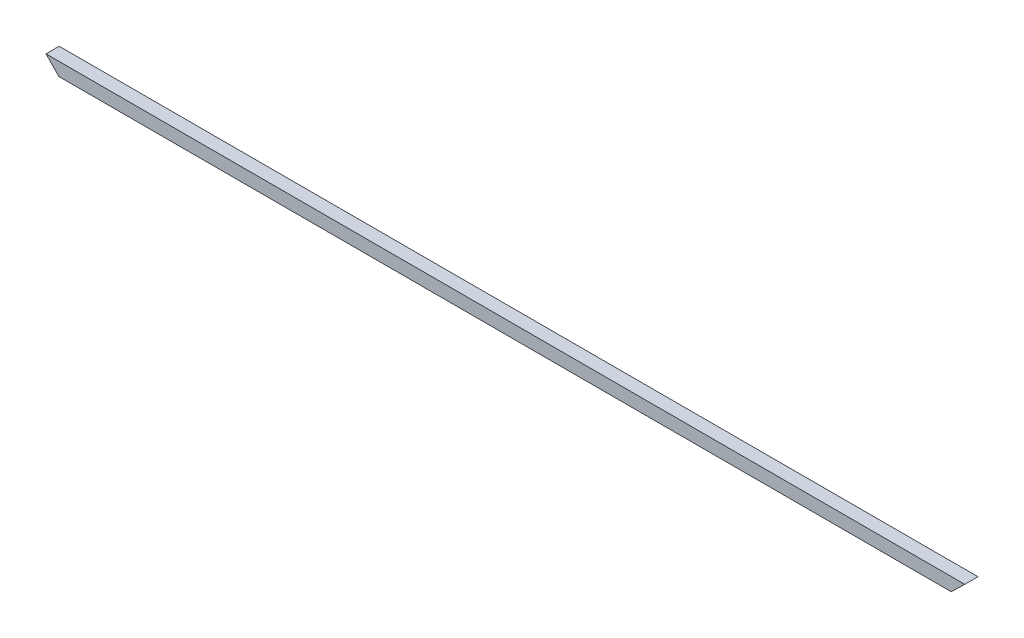
ISO-10303-21;
HEADER;
FILE_DESCRIPTION(('STEP AP214'),'2;1');
FILE_NAME('part.step','',(''),(''),'','','');
FILE_SCHEMA(('AUTOMOTIVE_DESIGN { 1 0 10303 214 1 1 1 1 }'));
ENDSEC;
DATA;
#1=APPLICATION_CONTEXT('core data for automotive mechanical design processes');
#2=APPLICATION_PROTOCOL_DEFINITION('international standard','automotive_design',2000,#1);
#3=PRODUCT_CONTEXT('',#1,'mechanical');
#4=PRODUCT('Part','Part','',(#3));
#5=PRODUCT_RELATED_PRODUCT_CATEGORY('part','',(#4));
#6=PRODUCT_DEFINITION_FORMATION('','',#4);
#7=PRODUCT_DEFINITION_CONTEXT('part definition',#1,'design');
#8=PRODUCT_DEFINITION('design','',#6,#7);
#9=PRODUCT_DEFINITION_SHAPE('','',#8);
#10=(LENGTH_UNIT() NAMED_UNIT(*) SI_UNIT(.MILLI.,.METRE.));
#11=(NAMED_UNIT(*) PLANE_ANGLE_UNIT() SI_UNIT($,.RADIAN.));
#12=(NAMED_UNIT(*) SI_UNIT($,.STERADIAN.) SOLID_ANGLE_UNIT());
#13=UNCERTAINTY_MEASURE_WITH_UNIT(LENGTH_MEASURE(1.E-05),#10,'distance_accuracy_value','');
#14=(GEOMETRIC_REPRESENTATION_CONTEXT(3) GLOBAL_UNCERTAINTY_ASSIGNED_CONTEXT((#13)) GLOBAL_UNIT_ASSIGNED_CONTEXT((#10,
#11,#12)) REPRESENTATION_CONTEXT('',''));
#15=CARTESIAN_POINT('',(0.,0.,0.));
#16=DIRECTION('',(0.,0.,1.));
#17=DIRECTION('',(1.,0.,0.));
#18=AXIS2_PLACEMENT_3D('',#15,#16,#17);
#19=CARTESIAN_POINT('',(-2723.04062869595,-40.0000000000003,40.));
#20=DIRECTION('',(0.71691060765048,0.697165102854568,0.));
#21=DIRECTION('',(-0.697165102854568,0.71691060765048,0.));
#22=AXIS2_PLACEMENT_3D('',#19,#20,#21);
#23=PLANE('',#22);
#24=DIRECTION('',(0.697165102854568,-0.71691060765048,0.));
#25=VECTOR('',#24,1.);
#26=CARTESIAN_POINT('',(-2723.04062869595,-40.0000000000003,0.));
#27=LINE('',#26,#25);
#28=CARTESIAN_POINT('',(-2761.93892900926,0.,0.));
#29=VERTEX_POINT('',#28);
#30=CARTESIAN_POINT('',(-2723.04062869595,-40.0000000000003,0.));
#31=VERTEX_POINT('',#30);
#32=EDGE_CURVE('E97',#29,#31,#27,.T.);
#33=ORIENTED_EDGE('',*,*,#32,.T.);
#34=DIRECTION('',(0.,0.,-1.));
#35=VECTOR('',#34,1.);
#36=CARTESIAN_POINT('',(-2723.04062869595,-40.0000000000003,40.));
#37=LINE('',#36,#35);
#38=CARTESIAN_POINT('',(-2723.04062869595,-40.0000000000003,40.));
#39=VERTEX_POINT('',#38);
#40=EDGE_CURVE('E11',#39,#31,#37,.T.);
#41=ORIENTED_EDGE('',*,*,#40,.F.);
#42=DIRECTION('',(0.697165102854568,-0.71691060765048,0.));
#43=VECTOR('',#42,1.);
#44=CARTESIAN_POINT('',(-2723.04062869595,-40.0000000000003,40.));
#45=LINE('',#44,#43);
#46=CARTESIAN_POINT('',(-2761.93892900926,0.,40.));
#47=VERTEX_POINT('',#46);
#48=EDGE_CURVE('E85',#47,#39,#45,.T.);
#49=ORIENTED_EDGE('',*,*,#48,.F.);
#50=DIRECTION('',(0.,0.,-1.));
#51=VECTOR('',#50,1.);
#52=CARTESIAN_POINT('',(-2761.93892900926,0.,40.));
#53=LINE('',#52,#51);
#54=EDGE_CURVE('E93',#47,#29,#53,.T.);
#55=ORIENTED_EDGE('',*,*,#54,.T.);
#56=EDGE_LOOP('',(#33,#41,#49,#55));
#57=FACE_BOUND('',#56,.T.);
#58=ADVANCED_FACE('F34',(#57),#23,.F.);
#59=CARTESIAN_POINT('',(-16.7718316582911,-40.,40.));
#60=DIRECTION('',(0.,1.,0.));
#61=DIRECTION('',(-1.,0.,0.));
#62=AXIS2_PLACEMENT_3D('',#59,#60,#61);
#63=PLANE('',#62);
#64=DIRECTION('',(1.,0.,0.));
#65=VECTOR('',#64,1.);
#66=CARTESIAN_POINT('',(-16.7718316582911,-40.,0.));
#67=LINE('',#66,#65);
#68=CARTESIAN_POINT('',(-16.7718316582911,-40.,0.));
#69=VERTEX_POINT('',#68);
#70=EDGE_CURVE('E89',#31,#69,#67,.T.);
#71=ORIENTED_EDGE('',*,*,#70,.T.);
#72=DIRECTION('',(0.,0.,-1.));
#73=VECTOR('',#72,1.);
#74=CARTESIAN_POINT('',(-16.7718316582911,-40.,40.));
#75=LINE('',#74,#73);
#76=CARTESIAN_POINT('',(-16.7718316582911,-40.,40.));
#77=VERTEX_POINT('',#76);
#78=EDGE_CURVE('E42',#77,#69,#75,.T.);
#79=ORIENTED_EDGE('',*,*,#78,.F.);
#80=DIRECTION('',(1.,0.,0.));
#81=VECTOR('',#80,1.);
#82=CARTESIAN_POINT('',(-16.7718316582911,-40.,40.));
#83=LINE('',#82,#81);
#84=EDGE_CURVE('E80',#39,#77,#83,.T.);
#85=ORIENTED_EDGE('',*,*,#84,.F.);
#86=ORIENTED_EDGE('',*,*,#40,.T.);
#87=EDGE_LOOP('',(#71,#79,#85,#86));
#88=FACE_BOUND('',#87,.T.);
#89=ADVANCED_FACE('F88',(#88),#63,.F.);
#90=CARTESIAN_POINT('',(24.3610709907416,0.,40.));
#91=DIRECTION('',(-0.697165102854561,0.716910607650486,0.));
#92=DIRECTION('',(-0.716910607650486,-0.697165102854561,0.));
#93=AXIS2_PLACEMENT_3D('',#90,#91,#92);
#94=PLANE('',#93);
#95=DIRECTION('',(0.716910607650486,0.697165102854561,0.));
#96=VECTOR('',#95,1.);
#97=CARTESIAN_POINT('',(24.3610709907416,0.,0.));
#98=LINE('',#97,#96);
#99=CARTESIAN_POINT('',(24.3610709907416,0.,0.));
#100=VERTEX_POINT('',#99);
#101=EDGE_CURVE('E67',#69,#100,#98,.T.);
#102=ORIENTED_EDGE('',*,*,#101,.T.);
#103=DIRECTION('',(0.,0.,-1.));
#104=VECTOR('',#103,1.);
#105=CARTESIAN_POINT('',(24.3610709907416,0.,40.));
#106=LINE('',#105,#104);
#107=CARTESIAN_POINT('',(24.3610709907416,0.,40.));
#108=VERTEX_POINT('',#107);
#109=EDGE_CURVE('E90',#108,#100,#106,.T.);
#110=ORIENTED_EDGE('',*,*,#109,.F.);
#111=DIRECTION('',(0.716910607650486,0.697165102854561,0.));
#112=VECTOR('',#111,1.);
#113=CARTESIAN_POINT('',(24.3610709907416,0.,40.));
#114=LINE('',#113,#112);
#115=EDGE_CURVE('E83',#77,#108,#114,.T.);
#116=ORIENTED_EDGE('',*,*,#115,.F.);
#117=ORIENTED_EDGE('',*,*,#78,.T.);
#118=EDGE_LOOP('',(#102,#110,#116,#117));
#119=FACE_BOUND('',#118,.T.);
#120=ADVANCED_FACE('F91',(#119),#94,.F.);
#121=CARTESIAN_POINT('',(-2761.93892900926,0.,40.));
#122=DIRECTION('',(0.,-1.,0.));
#123=DIRECTION('',(1.,0.,0.));
#124=AXIS2_PLACEMENT_3D('',#121,#122,#123);
#125=PLANE('',#124);
#126=DIRECTION('',(-1.,0.,0.));
#127=VECTOR('',#126,1.);
#128=CARTESIAN_POINT('',(-2761.93892900926,0.,0.));
#129=LINE('',#128,#127);
#130=EDGE_CURVE('E73',#100,#29,#129,.T.);
#131=ORIENTED_EDGE('',*,*,#130,.T.);
#132=ORIENTED_EDGE('',*,*,#54,.F.);
#133=DIRECTION('',(-1.,0.,0.));
#134=VECTOR('',#133,1.);
#135=CARTESIAN_POINT('',(-2761.93892900926,0.,40.));
#136=LINE('',#135,#134);
#137=EDGE_CURVE('E50',#108,#47,#136,.T.);
#138=ORIENTED_EDGE('',*,*,#137,.F.);
#139=ORIENTED_EDGE('',*,*,#109,.T.);
#140=EDGE_LOOP('',(#131,#132,#138,#139));
#141=FACE_BOUND('',#140,.T.);
#142=ADVANCED_FACE('F104',(#141),#125,.F.);
#143=CARTESIAN_POINT('',(0.,0.,40.));
#144=DIRECTION('',(0.,0.,1.));
#145=DIRECTION('',(1.,0.,0.));
#146=AXIS2_PLACEMENT_3D('',#143,#144,#145);
#147=PLANE('',#146);
#148=ORIENTED_EDGE('',*,*,#48,.T.);
#149=ORIENTED_EDGE('',*,*,#84,.T.);
#150=ORIENTED_EDGE('',*,*,#115,.T.);
#151=ORIENTED_EDGE('',*,*,#137,.T.);
#152=EDGE_LOOP('',(#148,#149,#150,#151));
#153=FACE_BOUND('',#152,.T.);
#154=ADVANCED_FACE('F81',(#153),#147,.T.);
#155=CARTESIAN_POINT('',(0.,0.,0.));
#156=DIRECTION('',(0.,0.,1.));
#157=DIRECTION('',(1.,0.,0.));
#158=AXIS2_PLACEMENT_3D('',#155,#156,#157);
#159=PLANE('',#158);
#160=ORIENTED_EDGE('',*,*,#32,.F.);
#161=ORIENTED_EDGE('',*,*,#130,.F.);
#162=ORIENTED_EDGE('',*,*,#101,.F.);
#163=ORIENTED_EDGE('',*,*,#70,.F.);
#164=EDGE_LOOP('',(#160,#161,#162,#163));
#165=FACE_BOUND('',#164,.T.);
#166=ADVANCED_FACE('F107',(#165),#159,.F.);
#167=CLOSED_SHELL('',(#58,#89,#120,#142,#154,#166));
#168=MANIFOLD_SOLID_BREP('B2',#167);
#169=ADVANCED_BREP_SHAPE_REPRESENTATION('',(#18,#168),#14);
#170=SHAPE_DEFINITION_REPRESENTATION(#9,#169);
ENDSEC;
END-ISO-10303-21;
